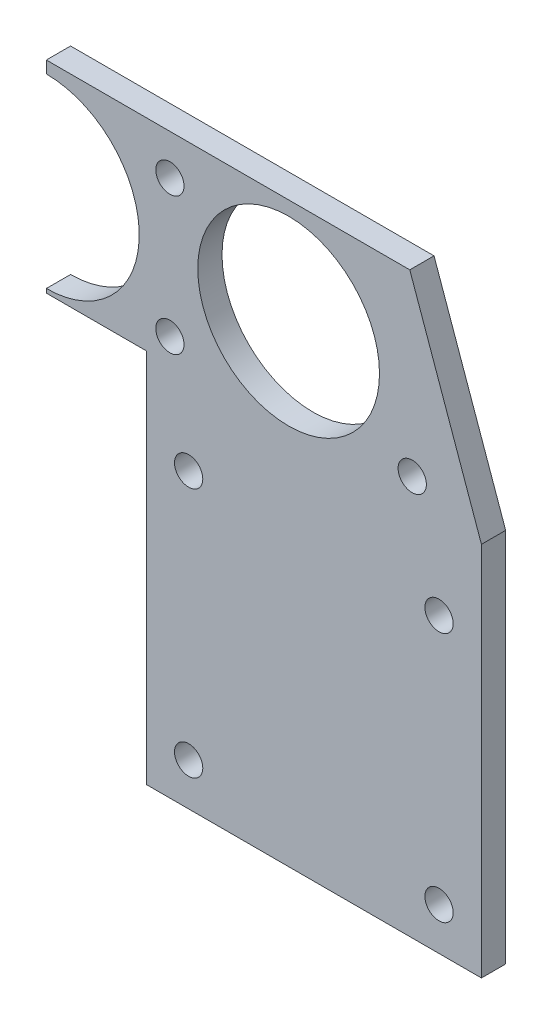
ISO-10303-21;
HEADER;
FILE_DESCRIPTION(('STEP AP214'),'2;1');
FILE_NAME('part.step','',(''),(''),'','','');
FILE_SCHEMA(('AUTOMOTIVE_DESIGN { 1 0 10303 214 1 1 1 1 }'));
ENDSEC;
DATA;
#1=APPLICATION_CONTEXT('core data for automotive mechanical design processes');
#2=APPLICATION_PROTOCOL_DEFINITION('international standard','automotive_design',2000,#1);
#3=PRODUCT_CONTEXT('',#1,'mechanical');
#4=PRODUCT('Part','Part','',(#3));
#5=PRODUCT_RELATED_PRODUCT_CATEGORY('part','',(#4));
#6=PRODUCT_DEFINITION_FORMATION('','',#4);
#7=PRODUCT_DEFINITION_CONTEXT('part definition',#1,'design');
#8=PRODUCT_DEFINITION('design','',#6,#7);
#9=PRODUCT_DEFINITION_SHAPE('','',#8);
#10=(LENGTH_UNIT() NAMED_UNIT(*) SI_UNIT(.MILLI.,.METRE.));
#11=(NAMED_UNIT(*) PLANE_ANGLE_UNIT() SI_UNIT($,.RADIAN.));
#12=(NAMED_UNIT(*) SI_UNIT($,.STERADIAN.) SOLID_ANGLE_UNIT());
#13=UNCERTAINTY_MEASURE_WITH_UNIT(LENGTH_MEASURE(1.E-05),#10,'distance_accuracy_value','');
#14=(GEOMETRIC_REPRESENTATION_CONTEXT(3) GLOBAL_UNCERTAINTY_ASSIGNED_CONTEXT((#13)) GLOBAL_UNIT_ASSIGNED_CONTEXT((#10,
#11,#12)) REPRESENTATION_CONTEXT('',''));
#15=CARTESIAN_POINT('',(0.,0.,0.));
#16=DIRECTION('',(0.,0.,1.));
#17=DIRECTION('',(1.,0.,0.));
#18=AXIS2_PLACEMENT_3D('',#15,#16,#17);
#19=CARTESIAN_POINT('',(-138.033440025577,42.8124722922434,3.));
#20=DIRECTION('',(0.,0.,1.));
#21=DIRECTION('',(1.,0.,0.));
#22=AXIS2_PLACEMENT_3D('',#19,#20,#21);
#23=PLANE('',#22);
#24=CARTESIAN_POINT('',(-122.733440025576,50.8124722922433,3.));
#25=DIRECTION('',(0.,0.,1.));
#26=DIRECTION('',(1.,0.,0.));
#27=AXIS2_PLACEMENT_3D('',#24,#25,#26);
#28=CIRCLE('',#27,1.75);
#29=CARTESIAN_POINT('',(-120.983440025576,50.8124722922433,3.));
#30=VERTEX_POINT('',#29);
#31=EDGE_CURVE('E237',#30,#30,#28,.T.);
#32=ORIENTED_EDGE('',*,*,#31,.F.);
#33=EDGE_LOOP('',(#32));
#34=FACE_BOUND('',#33,.T.);
#35=CARTESIAN_POINT('',(-108.033440025576,42.8124722922433,3.));
#36=DIRECTION('',(0.,0.,1.));
#37=DIRECTION('',(1.,0.,0.));
#38=AXIS2_PLACEMENT_3D('',#35,#36,#37);
#39=CIRCLE('',#38,11.25);
#40=CARTESIAN_POINT('',(-96.7834400255762,42.8124722922433,3.));
#41=VERTEX_POINT('',#40);
#42=EDGE_CURVE('E225',#41,#41,#39,.T.);
#43=ORIENTED_EDGE('',*,*,#42,.F.);
#44=EDGE_LOOP('',(#43));
#45=FACE_BOUND('',#44,.T.);
#46=CARTESIAN_POINT('',(-120.412997174755,-10.4375277077567,3.));
#47=DIRECTION('',(0.,0.,1.));
#48=DIRECTION('',(1.,0.,0.));
#49=AXIS2_PLACEMENT_3D('',#46,#47,#48);
#50=CIRCLE('',#49,1.75);
#51=CARTESIAN_POINT('',(-118.662997174755,-10.4375277077567,3.));
#52=VERTEX_POINT('',#51);
#53=EDGE_CURVE('E213',#52,#52,#50,.T.);
#54=ORIENTED_EDGE('',*,*,#53,.F.);
#55=EDGE_LOOP('',(#54));
#56=FACE_BOUND('',#55,.T.);
#57=CARTESIAN_POINT('',(-89.4129971747546,20.5624722922433,3.));
#58=DIRECTION('',(0.,0.,1.));
#59=DIRECTION('',(1.,0.,0.));
#60=AXIS2_PLACEMENT_3D('',#57,#58,#59);
#61=CIRCLE('',#60,1.75);
#62=CARTESIAN_POINT('',(-87.6629971747546,20.5624722922433,3.));
#63=VERTEX_POINT('',#62);
#64=EDGE_CURVE('E149',#63,#63,#61,.T.);
#65=ORIENTED_EDGE('',*,*,#64,.F.);
#66=EDGE_LOOP('',(#65));
#67=FACE_BOUND('',#66,.T.);
#68=DIRECTION('',(0.,1.,0.));
#69=VECTOR('',#68,1.);
#70=CARTESIAN_POINT('',(-84.1629971747485,25.8124722922433,3.));
#71=LINE('',#70,#69);
#72=CARTESIAN_POINT('',(-84.1629971747485,-15.6875277077568,3.));
#73=VERTEX_POINT('',#72);
#74=CARTESIAN_POINT('',(-84.1629971747485,30.8124722922433,3.));
#75=VERTEX_POINT('',#74);
#76=EDGE_CURVE('E56',#73,#75,#71,.T.);
#77=ORIENTED_EDGE('',*,*,#76,.T.);
#78=DIRECTION('',(-0.334392270884043,0.942433981333978,0.));
#79=VECTOR('',#78,1.);
#80=CARTESIAN_POINT('',(-84.1629971747485,30.8124722922433,3.));
#81=LINE('',#80,#79);
#82=CARTESIAN_POINT('',(-93.0334400255762,55.8124722922433,3.));
#83=VERTEX_POINT('',#82);
#84=EDGE_CURVE('E102',#75,#83,#81,.T.);
#85=ORIENTED_EDGE('',*,*,#84,.T.);
#86=DIRECTION('',(-1.,0.,0.));
#87=VECTOR('',#86,1.);
#88=CARTESIAN_POINT('',(-138.033440025576,55.8124722922433,3.));
#89=LINE('',#88,#87);
#90=CARTESIAN_POINT('',(-138.033440025576,55.8124722922433,3.));
#91=VERTEX_POINT('',#90);
#92=EDGE_CURVE('E179',#83,#91,#89,.T.);
#93=ORIENTED_EDGE('',*,*,#92,.T.);
#94=DIRECTION('',(7.77156117237436E-13,-1.,0.));
#95=VECTOR('',#94,1.);
#96=CARTESIAN_POINT('',(-138.033440025576,55.8124722922433,3.));
#97=LINE('',#96,#95);
#98=CARTESIAN_POINT('',(-138.033440025575,54.3124722922433,3.));
#99=VERTEX_POINT('',#98);
#100=EDGE_CURVE('E197',#91,#99,#97,.T.);
#101=ORIENTED_EDGE('',*,*,#100,.T.);
#102=CARTESIAN_POINT('',(-138.033440025577,42.8124722922434,3.));
#103=DIRECTION('',(0.,0.,-1.));
#104=DIRECTION('',(1.,0.,0.));
#105=AXIS2_PLACEMENT_3D('',#102,#103,#104);
#106=CIRCLE('',#105,11.4999999999999);
#107=CARTESIAN_POINT('',(-138.033440025576,31.3124722922433,3.));
#108=VERTEX_POINT('',#107);
#109=EDGE_CURVE('E196',#99,#108,#106,.T.);
#110=ORIENTED_EDGE('',*,*,#109,.T.);
#111=DIRECTION('',(0.,-1.,0.));
#112=VECTOR('',#111,1.);
#113=CARTESIAN_POINT('',(-138.033440025576,31.3124722922433,3.));
#114=LINE('',#113,#112);
#115=CARTESIAN_POINT('',(-138.033440025576,30.8124722922433,3.));
#116=VERTEX_POINT('',#115);
#117=EDGE_CURVE('E125',#108,#116,#114,.T.);
#118=ORIENTED_EDGE('',*,*,#117,.T.);
#119=DIRECTION('',(1.,0.,0.));
#120=VECTOR('',#119,1.);
#121=CARTESIAN_POINT('',(-125.662997174753,30.8124722922433,3.));
#122=LINE('',#121,#120);
#123=CARTESIAN_POINT('',(-125.662997174753,30.8124722922433,3.));
#124=VERTEX_POINT('',#123);
#125=EDGE_CURVE('E119',#116,#124,#122,.T.);
#126=ORIENTED_EDGE('',*,*,#125,.T.);
#127=DIRECTION('',(0.,-1.,0.));
#128=VECTOR('',#127,1.);
#129=CARTESIAN_POINT('',(-125.662997174753,25.8124722922433,3.));
#130=LINE('',#129,#128);
#131=CARTESIAN_POINT('',(-125.662997174753,-15.6875277077575,3.));
#132=VERTEX_POINT('',#131);
#133=EDGE_CURVE('E123',#124,#132,#130,.T.);
#134=ORIENTED_EDGE('',*,*,#133,.T.);
#135=DIRECTION('',(1.,0.,0.));
#136=VECTOR('',#135,1.);
#137=CARTESIAN_POINT('',(-125.662997174753,-15.6875277077575,3.));
#138=LINE('',#137,#136);
#139=EDGE_CURVE('E140',#132,#73,#138,.T.);
#140=ORIENTED_EDGE('',*,*,#139,.T.);
#141=EDGE_LOOP('',(#77,#85,#93,#101,#110,#118,#126,#134,#140));
#142=FACE_BOUND('',#141,.T.);
#143=CARTESIAN_POINT('',(-120.412997174755,20.5624722922433,3.));
#144=DIRECTION('',(0.,0.,1.));
#145=DIRECTION('',(1.,0.,0.));
#146=AXIS2_PLACEMENT_3D('',#143,#144,#145);
#147=CIRCLE('',#146,1.75);
#148=CARTESIAN_POINT('',(-118.662997174755,20.5624722922433,3.));
#149=VERTEX_POINT('',#148);
#150=EDGE_CURVE('E207',#149,#149,#147,.T.);
#151=ORIENTED_EDGE('',*,*,#150,.F.);
#152=EDGE_LOOP('',(#151));
#153=FACE_BOUND('',#152,.T.);
#154=CARTESIAN_POINT('',(-89.4129971747546,-10.4375277077568,3.));
#155=DIRECTION('',(0.,0.,1.));
#156=DIRECTION('',(1.,0.,0.));
#157=AXIS2_PLACEMENT_3D('',#154,#155,#156);
#158=CIRCLE('',#157,1.75);
#159=CARTESIAN_POINT('',(-87.6629971747546,-10.4375277077568,3.));
#160=VERTEX_POINT('',#159);
#161=EDGE_CURVE('E219',#160,#160,#158,.T.);
#162=ORIENTED_EDGE('',*,*,#161,.F.);
#163=EDGE_LOOP('',(#162));
#164=FACE_BOUND('',#163,.T.);
#165=CARTESIAN_POINT('',(-122.733440025576,33.8124722922433,3.));
#166=DIRECTION('',(0.,0.,1.));
#167=DIRECTION('',(1.,0.,0.));
#168=AXIS2_PLACEMENT_3D('',#165,#166,#167);
#169=CIRCLE('',#168,1.75);
#170=CARTESIAN_POINT('',(-120.983440025576,33.8124722922433,3.));
#171=VERTEX_POINT('',#170);
#172=EDGE_CURVE('E231',#171,#171,#169,.T.);
#173=ORIENTED_EDGE('',*,*,#172,.F.);
#174=EDGE_LOOP('',(#173));
#175=FACE_BOUND('',#174,.T.);
#176=CARTESIAN_POINT('',(-92.7334400255765,33.8124722922433,3.));
#177=DIRECTION('',(0.,0.,1.));
#178=DIRECTION('',(1.,0.,0.));
#179=AXIS2_PLACEMENT_3D('',#176,#177,#178);
#180=CIRCLE('',#179,1.75000000000001);
#181=CARTESIAN_POINT('',(-90.9834400255765,33.8124722922433,3.));
#182=VERTEX_POINT('',#181);
#183=EDGE_CURVE('E243',#182,#182,#180,.T.);
#184=ORIENTED_EDGE('',*,*,#183,.F.);
#185=EDGE_LOOP('',(#184));
#186=FACE_BOUND('',#185,.T.);
#187=ADVANCED_FACE('F39',(#34,#45,#56,#67,#142,#153,#164,#175,#186),#23,.T.);
#188=CARTESIAN_POINT('',(-138.033440025577,42.8124722922434,0.));
#189=DIRECTION('',(0.,0.,1.));
#190=DIRECTION('',(1.,0.,0.));
#191=AXIS2_PLACEMENT_3D('',#188,#189,#190);
#192=PLANE('',#191);
#193=DIRECTION('',(-0.334392270884043,0.942433981333978,0.));
#194=VECTOR('',#193,1.);
#195=CARTESIAN_POINT('',(-84.1629971747485,30.8124722922433,0.));
#196=LINE('',#195,#194);
#197=CARTESIAN_POINT('',(-84.1629971747485,30.8124722922433,0.));
#198=VERTEX_POINT('',#197);
#199=CARTESIAN_POINT('',(-93.0334400255762,55.8124722922433,0.));
#200=VERTEX_POINT('',#199);
#201=EDGE_CURVE('E146',#198,#200,#196,.T.);
#202=ORIENTED_EDGE('',*,*,#201,.F.);
#203=DIRECTION('',(0.,1.,0.));
#204=VECTOR('',#203,1.);
#205=CARTESIAN_POINT('',(-84.1629971747485,25.8124722922433,0.));
#206=LINE('',#205,#204);
#207=CARTESIAN_POINT('',(-84.1629971747485,-15.6875277077568,0.));
#208=VERTEX_POINT('',#207);
#209=EDGE_CURVE('E160',#208,#198,#206,.T.);
#210=ORIENTED_EDGE('',*,*,#209,.F.);
#211=DIRECTION('',(1.,0.,0.));
#212=VECTOR('',#211,1.);
#213=CARTESIAN_POINT('',(-125.662997174753,-15.6875277077575,0.));
#214=LINE('',#213,#212);
#215=CARTESIAN_POINT('',(-125.662997174753,-15.6875277077575,0.));
#216=VERTEX_POINT('',#215);
#217=EDGE_CURVE('E95',#216,#208,#214,.T.);
#218=ORIENTED_EDGE('',*,*,#217,.F.);
#219=DIRECTION('',(0.,-1.,0.));
#220=VECTOR('',#219,1.);
#221=CARTESIAN_POINT('',(-125.662997174753,25.8124722922433,0.));
#222=LINE('',#221,#220);
#223=CARTESIAN_POINT('',(-125.662997174753,30.8124722922433,0.));
#224=VERTEX_POINT('',#223);
#225=EDGE_CURVE('E88',#224,#216,#222,.T.);
#226=ORIENTED_EDGE('',*,*,#225,.F.);
#227=DIRECTION('',(1.,0.,0.));
#228=VECTOR('',#227,1.);
#229=CARTESIAN_POINT('',(-125.662997174753,30.8124722922433,0.));
#230=LINE('',#229,#228);
#231=CARTESIAN_POINT('',(-138.033440025576,30.8124722922433,0.));
#232=VERTEX_POINT('',#231);
#233=EDGE_CURVE('E134',#232,#224,#230,.T.);
#234=ORIENTED_EDGE('',*,*,#233,.F.);
#235=DIRECTION('',(0.,-1.,0.));
#236=VECTOR('',#235,1.);
#237=CARTESIAN_POINT('',(-138.033440025576,31.3124722922433,0.));
#238=LINE('',#237,#236);
#239=CARTESIAN_POINT('',(-138.033440025576,31.3124722922433,0.));
#240=VERTEX_POINT('',#239);
#241=EDGE_CURVE('E155',#240,#232,#238,.T.);
#242=ORIENTED_EDGE('',*,*,#241,.F.);
#243=CARTESIAN_POINT('',(-138.033440025577,42.8124722922434,0.));
#244=DIRECTION('',(0.,0.,-1.));
#245=DIRECTION('',(1.,0.,0.));
#246=AXIS2_PLACEMENT_3D('',#243,#244,#245);
#247=CIRCLE('',#246,11.4999999999999);
#248=CARTESIAN_POINT('',(-138.033440025575,54.3124722922433,0.));
#249=VERTEX_POINT('',#248);
#250=EDGE_CURVE('E153',#249,#240,#247,.T.);
#251=ORIENTED_EDGE('',*,*,#250,.F.);
#252=DIRECTION('',(7.77156117237436E-13,-1.,0.));
#253=VECTOR('',#252,1.);
#254=CARTESIAN_POINT('',(-138.033440025576,55.8124722922433,0.));
#255=LINE('',#254,#253);
#256=CARTESIAN_POINT('',(-138.033440025576,55.8124722922433,0.));
#257=VERTEX_POINT('',#256);
#258=EDGE_CURVE('E151',#257,#249,#255,.T.);
#259=ORIENTED_EDGE('',*,*,#258,.F.);
#260=DIRECTION('',(-1.,0.,0.));
#261=VECTOR('',#260,1.);
#262=CARTESIAN_POINT('',(-138.033440025576,55.8124722922433,0.));
#263=LINE('',#262,#261);
#264=EDGE_CURVE('E148',#200,#257,#263,.T.);
#265=ORIENTED_EDGE('',*,*,#264,.F.);
#266=EDGE_LOOP('',(#202,#210,#218,#226,#234,#242,#251,#259,#265));
#267=FACE_BOUND('',#266,.T.);
#268=CARTESIAN_POINT('',(-89.4129971747546,20.5624722922433,0.));
#269=DIRECTION('',(0.,0.,1.));
#270=DIRECTION('',(1.,0.,0.));
#271=AXIS2_PLACEMENT_3D('',#268,#269,#270);
#272=CIRCLE('',#271,1.75);
#273=CARTESIAN_POINT('',(-87.6629971747546,20.5624722922433,0.));
#274=VERTEX_POINT('',#273);
#275=EDGE_CURVE('E204',#274,#274,#272,.T.);
#276=ORIENTED_EDGE('',*,*,#275,.T.);
#277=EDGE_LOOP('',(#276));
#278=FACE_BOUND('',#277,.T.);
#279=CARTESIAN_POINT('',(-120.412997174755,20.5624722922433,0.));
#280=DIRECTION('',(0.,0.,1.));
#281=DIRECTION('',(1.,0.,0.));
#282=AXIS2_PLACEMENT_3D('',#279,#280,#281);
#283=CIRCLE('',#282,1.75);
#284=CARTESIAN_POINT('',(-118.662997174755,20.5624722922433,0.));
#285=VERTEX_POINT('',#284);
#286=EDGE_CURVE('E210',#285,#285,#283,.T.);
#287=ORIENTED_EDGE('',*,*,#286,.T.);
#288=EDGE_LOOP('',(#287));
#289=FACE_BOUND('',#288,.T.);
#290=CARTESIAN_POINT('',(-120.412997174755,-10.4375277077567,0.));
#291=DIRECTION('',(0.,0.,1.));
#292=DIRECTION('',(1.,0.,0.));
#293=AXIS2_PLACEMENT_3D('',#290,#291,#292);
#294=CIRCLE('',#293,1.75);
#295=CARTESIAN_POINT('',(-118.662997174755,-10.4375277077567,0.));
#296=VERTEX_POINT('',#295);
#297=EDGE_CURVE('E216',#296,#296,#294,.T.);
#298=ORIENTED_EDGE('',*,*,#297,.T.);
#299=EDGE_LOOP('',(#298));
#300=FACE_BOUND('',#299,.T.);
#301=CARTESIAN_POINT('',(-89.4129971747546,-10.4375277077568,0.));
#302=DIRECTION('',(0.,0.,1.));
#303=DIRECTION('',(1.,0.,0.));
#304=AXIS2_PLACEMENT_3D('',#301,#302,#303);
#305=CIRCLE('',#304,1.75);
#306=CARTESIAN_POINT('',(-87.6629971747546,-10.4375277077568,0.));
#307=VERTEX_POINT('',#306);
#308=EDGE_CURVE('E222',#307,#307,#305,.T.);
#309=ORIENTED_EDGE('',*,*,#308,.T.);
#310=EDGE_LOOP('',(#309));
#311=FACE_BOUND('',#310,.T.);
#312=CARTESIAN_POINT('',(-108.033440025576,42.8124722922433,0.));
#313=DIRECTION('',(0.,0.,1.));
#314=DIRECTION('',(1.,0.,0.));
#315=AXIS2_PLACEMENT_3D('',#312,#313,#314);
#316=CIRCLE('',#315,11.25);
#317=CARTESIAN_POINT('',(-96.7834400255762,42.8124722922433,0.));
#318=VERTEX_POINT('',#317);
#319=EDGE_CURVE('E228',#318,#318,#316,.T.);
#320=ORIENTED_EDGE('',*,*,#319,.T.);
#321=EDGE_LOOP('',(#320));
#322=FACE_BOUND('',#321,.T.);
#323=CARTESIAN_POINT('',(-122.733440025576,33.8124722922433,0.));
#324=DIRECTION('',(0.,0.,1.));
#325=DIRECTION('',(1.,0.,0.));
#326=AXIS2_PLACEMENT_3D('',#323,#324,#325);
#327=CIRCLE('',#326,1.75);
#328=CARTESIAN_POINT('',(-120.983440025576,33.8124722922433,0.));
#329=VERTEX_POINT('',#328);
#330=EDGE_CURVE('E234',#329,#329,#327,.T.);
#331=ORIENTED_EDGE('',*,*,#330,.T.);
#332=EDGE_LOOP('',(#331));
#333=FACE_BOUND('',#332,.T.);
#334=CARTESIAN_POINT('',(-122.733440025576,50.8124722922433,0.));
#335=DIRECTION('',(0.,0.,1.));
#336=DIRECTION('',(1.,0.,0.));
#337=AXIS2_PLACEMENT_3D('',#334,#335,#336);
#338=CIRCLE('',#337,1.75);
#339=CARTESIAN_POINT('',(-120.983440025576,50.8124722922433,0.));
#340=VERTEX_POINT('',#339);
#341=EDGE_CURVE('E240',#340,#340,#338,.T.);
#342=ORIENTED_EDGE('',*,*,#341,.T.);
#343=EDGE_LOOP('',(#342));
#344=FACE_BOUND('',#343,.T.);
#345=CARTESIAN_POINT('',(-92.7334400255765,33.8124722922433,0.));
#346=DIRECTION('',(0.,0.,1.));
#347=DIRECTION('',(1.,0.,0.));
#348=AXIS2_PLACEMENT_3D('',#345,#346,#347);
#349=CIRCLE('',#348,1.75000000000001);
#350=CARTESIAN_POINT('',(-90.9834400255765,33.8124722922433,0.));
#351=VERTEX_POINT('',#350);
#352=EDGE_CURVE('E246',#351,#351,#349,.T.);
#353=ORIENTED_EDGE('',*,*,#352,.T.);
#354=EDGE_LOOP('',(#353));
#355=FACE_BOUND('',#354,.T.);
#356=ADVANCED_FACE('F183',(#267,#278,#289,#300,#311,#322,#333,#344,#355),#192,.F.);
#357=CARTESIAN_POINT('',(-84.1629971747485,30.8124722922433,3.));
#358=DIRECTION('',(-0.942433981333978,-0.334392270884043,0.));
#359=DIRECTION('',(0.334392270884043,-0.942433981333978,0.));
#360=AXIS2_PLACEMENT_3D('',#357,#358,#359);
#361=PLANE('',#360);
#362=ORIENTED_EDGE('',*,*,#201,.T.);
#363=DIRECTION('',(0.,0.,-1.));
#364=VECTOR('',#363,1.);
#365=CARTESIAN_POINT('',(-93.0334400255762,55.8124722922433,3.));
#366=LINE('',#365,#364);
#367=EDGE_CURVE('E48',#83,#200,#366,.T.);
#368=ORIENTED_EDGE('',*,*,#367,.F.);
#369=ORIENTED_EDGE('',*,*,#84,.F.);
#370=DIRECTION('',(0.,0.,-1.));
#371=VECTOR('',#370,1.);
#372=CARTESIAN_POINT('',(-84.1629971747485,30.8124722922433,3.));
#373=LINE('',#372,#371);
#374=EDGE_CURVE('E11',#75,#198,#373,.T.);
#375=ORIENTED_EDGE('',*,*,#374,.T.);
#376=EDGE_LOOP('',(#362,#368,#369,#375));
#377=FACE_BOUND('',#376,.T.);
#378=ADVANCED_FACE('F41',(#377),#361,.F.);
#379=CARTESIAN_POINT('',(-138.033440025576,55.8124722922433,3.));
#380=DIRECTION('',(0.,-1.,0.));
#381=DIRECTION('',(1.,0.,0.));
#382=AXIS2_PLACEMENT_3D('',#379,#380,#381);
#383=PLANE('',#382);
#384=ORIENTED_EDGE('',*,*,#264,.T.);
#385=DIRECTION('',(0.,0.,-1.));
#386=VECTOR('',#385,1.);
#387=CARTESIAN_POINT('',(-138.033440025576,55.8124722922433,3.));
#388=LINE('',#387,#386);
#389=EDGE_CURVE('E171',#91,#257,#388,.T.);
#390=ORIENTED_EDGE('',*,*,#389,.F.);
#391=ORIENTED_EDGE('',*,*,#92,.F.);
#392=ORIENTED_EDGE('',*,*,#367,.T.);
#393=EDGE_LOOP('',(#384,#390,#391,#392));
#394=FACE_BOUND('',#393,.T.);
#395=ADVANCED_FACE('F177',(#394),#383,.F.);
#396=CARTESIAN_POINT('',(-138.033440025576,55.8124722922433,3.));
#397=DIRECTION('',(1.,7.77156117237436E-13,0.));
#398=DIRECTION('',(-7.77156117237436E-13,1.,0.));
#399=AXIS2_PLACEMENT_3D('',#396,#397,#398);
#400=PLANE('',#399);
#401=ORIENTED_EDGE('',*,*,#258,.T.);
#402=DIRECTION('',(0.,0.,-1.));
#403=VECTOR('',#402,1.);
#404=CARTESIAN_POINT('',(-138.033440025575,54.3124722922433,3.));
#405=LINE('',#404,#403);
#406=EDGE_CURVE('E168',#99,#249,#405,.T.);
#407=ORIENTED_EDGE('',*,*,#406,.F.);
#408=ORIENTED_EDGE('',*,*,#100,.F.);
#409=ORIENTED_EDGE('',*,*,#389,.T.);
#410=EDGE_LOOP('',(#401,#407,#408,#409));
#411=FACE_BOUND('',#410,.T.);
#412=ADVANCED_FACE('F190',(#411),#400,.F.);
#413=CARTESIAN_POINT('',(-138.033440025577,42.8124722922434,3.));
#414=DIRECTION('',(0.,0.,-1.));
#415=DIRECTION('',(-1.,0.,0.));
#416=AXIS2_PLACEMENT_3D('',#413,#414,#415);
#417=CYLINDRICAL_SURFACE('',#416,11.4999999999999);
#418=ORIENTED_EDGE('',*,*,#250,.T.);
#419=DIRECTION('',(0.,0.,-1.));
#420=VECTOR('',#419,1.);
#421=CARTESIAN_POINT('',(-138.033440025576,31.3124722922433,3.));
#422=LINE('',#421,#420);
#423=EDGE_CURVE('E165',#108,#240,#422,.T.);
#424=ORIENTED_EDGE('',*,*,#423,.F.);
#425=ORIENTED_EDGE('',*,*,#109,.F.);
#426=ORIENTED_EDGE('',*,*,#406,.T.);
#427=EDGE_LOOP('',(#418,#424,#425,#426));
#428=FACE_BOUND('',#427,.T.);
#429=ADVANCED_FACE('F194',(#428),#417,.F.);
#430=CARTESIAN_POINT('',(-138.033440025576,31.3124722922433,3.));
#431=DIRECTION('',(1.,0.,0.));
#432=DIRECTION('',(0.,0.,-1.));
#433=AXIS2_PLACEMENT_3D('',#430,#431,#432);
#434=PLANE('',#433);
#435=ORIENTED_EDGE('',*,*,#241,.T.);
#436=DIRECTION('',(0.,0.,-1.));
#437=VECTOR('',#436,1.);
#438=CARTESIAN_POINT('',(-138.033440025576,30.8124722922433,3.));
#439=LINE('',#438,#437);
#440=EDGE_CURVE('E135',#116,#232,#439,.T.);
#441=ORIENTED_EDGE('',*,*,#440,.F.);
#442=ORIENTED_EDGE('',*,*,#117,.F.);
#443=ORIENTED_EDGE('',*,*,#423,.T.);
#444=EDGE_LOOP('',(#435,#441,#442,#443));
#445=FACE_BOUND('',#444,.T.);
#446=ADVANCED_FACE('F278',(#445),#434,.F.);
#447=CARTESIAN_POINT('',(-125.662997174753,30.8124722922433,3.));
#448=DIRECTION('',(0.,1.,0.));
#449=DIRECTION('',(-1.,0.,0.));
#450=AXIS2_PLACEMENT_3D('',#447,#448,#449);
#451=PLANE('',#450);
#452=ORIENTED_EDGE('',*,*,#233,.T.);
#453=DIRECTION('',(0.,0.,-1.));
#454=VECTOR('',#453,1.);
#455=CARTESIAN_POINT('',(-125.662997174753,30.8124722922433,3.));
#456=LINE('',#455,#454);
#457=EDGE_CURVE('E131',#124,#224,#456,.T.);
#458=ORIENTED_EDGE('',*,*,#457,.F.);
#459=ORIENTED_EDGE('',*,*,#125,.F.);
#460=ORIENTED_EDGE('',*,*,#440,.T.);
#461=EDGE_LOOP('',(#452,#458,#459,#460));
#462=FACE_BOUND('',#461,.T.);
#463=ADVANCED_FACE('F132',(#462),#451,.F.);
#464=CARTESIAN_POINT('',(-125.662997174753,25.8124722922433,3.));
#465=DIRECTION('',(1.,0.,0.));
#466=DIRECTION('',(0.,0.,-1.));
#467=AXIS2_PLACEMENT_3D('',#464,#465,#466);
#468=PLANE('',#467);
#469=ORIENTED_EDGE('',*,*,#225,.T.);
#470=DIRECTION('',(0.,0.,-1.));
#471=VECTOR('',#470,1.);
#472=CARTESIAN_POINT('',(-125.662997174753,-15.6875277077575,3.));
#473=LINE('',#472,#471);
#474=EDGE_CURVE('E136',#132,#216,#473,.T.);
#475=ORIENTED_EDGE('',*,*,#474,.F.);
#476=ORIENTED_EDGE('',*,*,#133,.F.);
#477=ORIENTED_EDGE('',*,*,#457,.T.);
#478=EDGE_LOOP('',(#469,#475,#476,#477));
#479=FACE_BOUND('',#478,.T.);
#480=ADVANCED_FACE('F138',(#479),#468,.F.);
#481=CARTESIAN_POINT('',(-125.662997174753,-15.6875277077575,3.));
#482=DIRECTION('',(0.,1.,0.));
#483=DIRECTION('',(-1.,0.,0.));
#484=AXIS2_PLACEMENT_3D('',#481,#482,#483);
#485=PLANE('',#484);
#486=ORIENTED_EDGE('',*,*,#217,.T.);
#487=DIRECTION('',(0.,0.,-1.));
#488=VECTOR('',#487,1.);
#489=CARTESIAN_POINT('',(-84.1629971747485,-15.6875277077568,3.));
#490=LINE('',#489,#488);
#491=EDGE_CURVE('E142',#73,#208,#490,.T.);
#492=ORIENTED_EDGE('',*,*,#491,.F.);
#493=ORIENTED_EDGE('',*,*,#139,.F.);
#494=ORIENTED_EDGE('',*,*,#474,.T.);
#495=EDGE_LOOP('',(#486,#492,#493,#494));
#496=FACE_BOUND('',#495,.T.);
#497=ADVANCED_FACE('F271',(#496),#485,.F.);
#498=CARTESIAN_POINT('',(-84.1629971747485,25.8124722922433,3.));
#499=DIRECTION('',(-1.,0.,0.));
#500=DIRECTION('',(0.,0.,1.));
#501=AXIS2_PLACEMENT_3D('',#498,#499,#500);
#502=PLANE('',#501);
#503=ORIENTED_EDGE('',*,*,#209,.T.);
#504=ORIENTED_EDGE('',*,*,#374,.F.);
#505=ORIENTED_EDGE('',*,*,#76,.F.);
#506=ORIENTED_EDGE('',*,*,#491,.T.);
#507=EDGE_LOOP('',(#503,#504,#505,#506));
#508=FACE_BOUND('',#507,.T.);
#509=ADVANCED_FACE('F268',(#508),#502,.F.);
#510=CARTESIAN_POINT('',(-89.4129971747546,20.5624722922433,3.));
#511=DIRECTION('',(0.,0.,-1.));
#512=DIRECTION('',(-1.,0.,0.));
#513=AXIS2_PLACEMENT_3D('',#510,#511,#512);
#514=CYLINDRICAL_SURFACE('',#513,1.75);
#515=ORIENTED_EDGE('',*,*,#64,.T.);
#516=EDGE_LOOP('',(#515));
#517=FACE_BOUND('',#516,.T.);
#518=ORIENTED_EDGE('',*,*,#275,.F.);
#519=EDGE_LOOP('',(#518));
#520=FACE_BOUND('',#519,.T.);
#521=ADVANCED_FACE('F265',(#517,#520),#514,.F.);
#522=CARTESIAN_POINT('',(-120.412997174755,20.5624722922433,3.));
#523=DIRECTION('',(0.,0.,-1.));
#524=DIRECTION('',(-1.,0.,0.));
#525=AXIS2_PLACEMENT_3D('',#522,#523,#524);
#526=CYLINDRICAL_SURFACE('',#525,1.75);
#527=ORIENTED_EDGE('',*,*,#150,.T.);
#528=EDGE_LOOP('',(#527));
#529=FACE_BOUND('',#528,.T.);
#530=ORIENTED_EDGE('',*,*,#286,.F.);
#531=EDGE_LOOP('',(#530));
#532=FACE_BOUND('',#531,.T.);
#533=ADVANCED_FACE('F393',(#529,#532),#526,.F.);
#534=CARTESIAN_POINT('',(-120.412997174755,-10.4375277077567,3.));
#535=DIRECTION('',(0.,0.,-1.));
#536=DIRECTION('',(-1.,0.,0.));
#537=AXIS2_PLACEMENT_3D('',#534,#535,#536);
#538=CYLINDRICAL_SURFACE('',#537,1.75);
#539=ORIENTED_EDGE('',*,*,#53,.T.);
#540=EDGE_LOOP('',(#539));
#541=FACE_BOUND('',#540,.T.);
#542=ORIENTED_EDGE('',*,*,#297,.F.);
#543=EDGE_LOOP('',(#542));
#544=FACE_BOUND('',#543,.T.);
#545=ADVANCED_FACE('F404',(#541,#544),#538,.F.);
#546=CARTESIAN_POINT('',(-89.4129971747546,-10.4375277077568,3.));
#547=DIRECTION('',(0.,0.,-1.));
#548=DIRECTION('',(-1.,0.,0.));
#549=AXIS2_PLACEMENT_3D('',#546,#547,#548);
#550=CYLINDRICAL_SURFACE('',#549,1.75);
#551=ORIENTED_EDGE('',*,*,#161,.T.);
#552=EDGE_LOOP('',(#551));
#553=FACE_BOUND('',#552,.T.);
#554=ORIENTED_EDGE('',*,*,#308,.F.);
#555=EDGE_LOOP('',(#554));
#556=FACE_BOUND('',#555,.T.);
#557=ADVANCED_FACE('F415',(#553,#556),#550,.F.);
#558=CARTESIAN_POINT('',(-108.033440025576,42.8124722922433,3.));
#559=DIRECTION('',(0.,0.,-1.));
#560=DIRECTION('',(-1.,0.,0.));
#561=AXIS2_PLACEMENT_3D('',#558,#559,#560);
#562=CYLINDRICAL_SURFACE('',#561,11.25);
#563=ORIENTED_EDGE('',*,*,#42,.T.);
#564=EDGE_LOOP('',(#563));
#565=FACE_BOUND('',#564,.T.);
#566=ORIENTED_EDGE('',*,*,#319,.F.);
#567=EDGE_LOOP('',(#566));
#568=FACE_BOUND('',#567,.T.);
#569=ADVANCED_FACE('F427',(#565,#568),#562,.F.);
#570=CARTESIAN_POINT('',(-122.733440025576,33.8124722922433,3.));
#571=DIRECTION('',(0.,0.,-1.));
#572=DIRECTION('',(-1.,0.,0.));
#573=AXIS2_PLACEMENT_3D('',#570,#571,#572);
#574=CYLINDRICAL_SURFACE('',#573,1.75);
#575=ORIENTED_EDGE('',*,*,#172,.T.);
#576=EDGE_LOOP('',(#575));
#577=FACE_BOUND('',#576,.T.);
#578=ORIENTED_EDGE('',*,*,#330,.F.);
#579=EDGE_LOOP('',(#578));
#580=FACE_BOUND('',#579,.T.);
#581=ADVANCED_FACE('F439',(#577,#580),#574,.F.);
#582=CARTESIAN_POINT('',(-122.733440025576,50.8124722922433,3.));
#583=DIRECTION('',(0.,0.,-1.));
#584=DIRECTION('',(-1.,0.,0.));
#585=AXIS2_PLACEMENT_3D('',#582,#583,#584);
#586=CYLINDRICAL_SURFACE('',#585,1.75);
#587=ORIENTED_EDGE('',*,*,#31,.T.);
#588=EDGE_LOOP('',(#587));
#589=FACE_BOUND('',#588,.T.);
#590=ORIENTED_EDGE('',*,*,#341,.F.);
#591=EDGE_LOOP('',(#590));
#592=FACE_BOUND('',#591,.T.);
#593=ADVANCED_FACE('F451',(#589,#592),#586,.F.);
#594=CARTESIAN_POINT('',(-92.7334400255765,33.8124722922433,3.));
#595=DIRECTION('',(0.,0.,-1.));
#596=DIRECTION('',(-1.,0.,0.));
#597=AXIS2_PLACEMENT_3D('',#594,#595,#596);
#598=CYLINDRICAL_SURFACE('',#597,1.75000000000001);
#599=ORIENTED_EDGE('',*,*,#183,.T.);
#600=EDGE_LOOP('',(#599));
#601=FACE_BOUND('',#600,.T.);
#602=ORIENTED_EDGE('',*,*,#352,.F.);
#603=EDGE_LOOP('',(#602));
#604=FACE_BOUND('',#603,.T.);
#605=ADVANCED_FACE('F252',(#601,#604),#598,.F.);
#606=CLOSED_SHELL('',(#187,#356,#378,#395,#412,#429,#446,#463,#480,#497,#509,#521,#533,#545,
#557,#569,#581,#593,#605));
#607=MANIFOLD_SOLID_BREP('B2',#606);
#608=ADVANCED_BREP_SHAPE_REPRESENTATION('',(#18,#607),#14);
#609=SHAPE_DEFINITION_REPRESENTATION(#9,#608);
ENDSEC;
END-ISO-10303-21;
